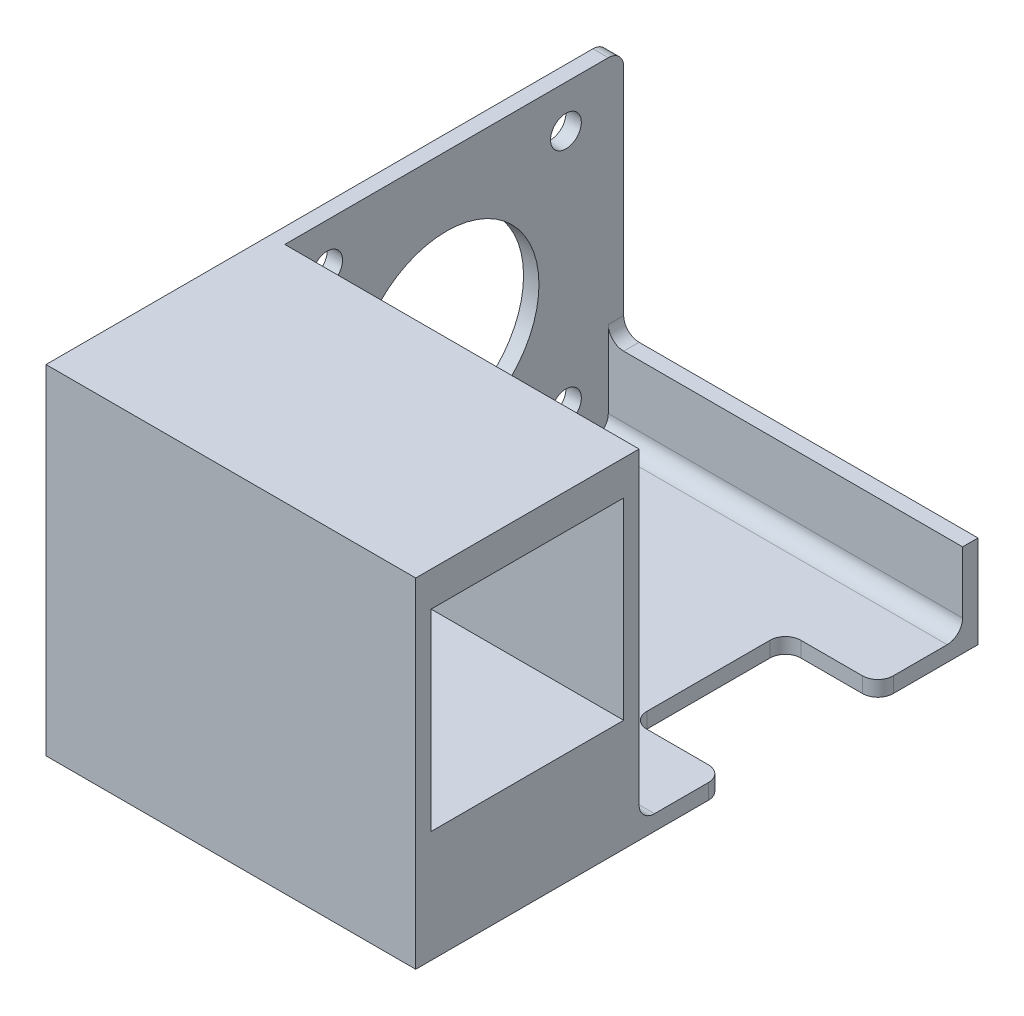
ISO-10303-21;
HEADER;
FILE_DESCRIPTION(('STEP AP214'),'2;1');
FILE_NAME('part.step','',(''),(''),'','','');
FILE_SCHEMA(('AUTOMOTIVE_DESIGN { 1 0 10303 214 1 1 1 1 }'));
ENDSEC;
DATA;
#1=APPLICATION_CONTEXT('core data for automotive mechanical design processes');
#2=APPLICATION_PROTOCOL_DEFINITION('international standard','automotive_design',2000,#1);
#3=PRODUCT_CONTEXT('',#1,'mechanical');
#4=PRODUCT('Part','Part','',(#3));
#5=PRODUCT_RELATED_PRODUCT_CATEGORY('part','',(#4));
#6=PRODUCT_DEFINITION_FORMATION('','',#4);
#7=PRODUCT_DEFINITION_CONTEXT('part definition',#1,'design');
#8=PRODUCT_DEFINITION('design','',#6,#7);
#9=PRODUCT_DEFINITION_SHAPE('','',#8);
#10=(LENGTH_UNIT() NAMED_UNIT(*) SI_UNIT(.MILLI.,.METRE.));
#11=(NAMED_UNIT(*) PLANE_ANGLE_UNIT() SI_UNIT($,.RADIAN.));
#12=(NAMED_UNIT(*) SI_UNIT($,.STERADIAN.) SOLID_ANGLE_UNIT());
#13=UNCERTAINTY_MEASURE_WITH_UNIT(LENGTH_MEASURE(1.E-05),#10,'distance_accuracy_value','');
#14=(GEOMETRIC_REPRESENTATION_CONTEXT(3) GLOBAL_UNCERTAINTY_ASSIGNED_CONTEXT((#13)) GLOBAL_UNIT_ASSIGNED_CONTEXT((#10,
#11,#12)) REPRESENTATION_CONTEXT('',''));
#15=CARTESIAN_POINT('',(0.,0.,0.));
#16=DIRECTION('',(0.,0.,1.));
#17=DIRECTION('',(1.,0.,0.));
#18=AXIS2_PLACEMENT_3D('',#15,#16,#17);
#19=CARTESIAN_POINT('',(24.,14.5,29.));
#20=DIRECTION('',(-1.,0.,0.));
#21=DIRECTION('',(0.,-1.,0.));
#22=AXIS2_PLACEMENT_3D('',#19,#20,#21);
#23=PLANE('',#22);
#24=DIRECTION('',(0.,0.,-1.));
#25=VECTOR('',#24,1.);
#26=CARTESIAN_POINT('',(24.,-23.,2.));
#27=LINE('',#26,#25);
#28=CARTESIAN_POINT('',(24.,-23.,29.));
#29=VERTEX_POINT('',#28);
#30=CARTESIAN_POINT('',(24.,-23.,-9.00000000000001));
#31=VERTEX_POINT('',#30);
#32=EDGE_CURVE('E326',#29,#31,#27,.T.);
#33=ORIENTED_EDGE('',*,*,#32,.T.);
#34=DIRECTION('',(0.,1.,0.));
#35=VECTOR('',#34,1.);
#36=CARTESIAN_POINT('',(24.,14.5,-9.00000000000001));
#37=LINE('',#36,#35);
#38=CARTESIAN_POINT('',(24.,-21.,-9.00000000000001));
#39=VERTEX_POINT('',#38);
#40=EDGE_CURVE('E409',#31,#39,#37,.T.);
#41=ORIENTED_EDGE('',*,*,#40,.T.);
#42=DIRECTION('',(0.,0.,-1.));
#43=VECTOR('',#42,1.);
#44=CARTESIAN_POINT('',(24.,-21.,2.));
#45=LINE('',#44,#43);
#46=CARTESIAN_POINT('',(24.,-21.,-2.));
#47=VERTEX_POINT('',#46);
#48=EDGE_CURVE('E321',#47,#39,#45,.T.);
#49=ORIENTED_EDGE('',*,*,#48,.F.);
#50=CARTESIAN_POINT('',(24.,-19.,-2.));
#51=DIRECTION('',(-1.,0.,0.));
#52=DIRECTION('',(0.,-1.,0.));
#53=AXIS2_PLACEMENT_3D('',#50,#51,#52);
#54=CIRCLE('',#53,2.);
#55=CARTESIAN_POINT('',(24.,-19.,0.));
#56=VERTEX_POINT('',#55);
#57=EDGE_CURVE('E365',#47,#56,#54,.T.);
#58=ORIENTED_EDGE('',*,*,#57,.T.);
#59=DIRECTION('',(0.,1.,0.));
#60=VECTOR('',#59,1.);
#61=CARTESIAN_POINT('',(24.,14.5,0.));
#62=LINE('',#61,#60);
#63=CARTESIAN_POINT('',(24.,21.,0.));
#64=VERTEX_POINT('',#63);
#65=EDGE_CURVE('E332',#56,#64,#62,.T.);
#66=ORIENTED_EDGE('',*,*,#65,.T.);
#67=DIRECTION('',(0.,0.,1.));
#68=VECTOR('',#67,1.);
#69=CARTESIAN_POINT('',(24.,21.,-44.));
#70=LINE('',#69,#68);
#71=CARTESIAN_POINT('',(24.,21.,29.));
#72=VERTEX_POINT('',#71);
#73=EDGE_CURVE('E238',#64,#72,#70,.T.);
#74=ORIENTED_EDGE('',*,*,#73,.T.);
#75=DIRECTION('',(0.,1.,0.));
#76=VECTOR('',#75,1.);
#77=CARTESIAN_POINT('',(24.,14.5,29.));
#78=LINE('',#77,#76);
#79=EDGE_CURVE('E337',#29,#72,#78,.T.);
#80=ORIENTED_EDGE('',*,*,#79,.F.);
#81=EDGE_LOOP('',(#33,#41,#49,#58,#66,#74,#80));
#82=FACE_BOUND('',#81,.T.);
#83=DIRECTION('',(0.,0.,-1.));
#84=VECTOR('',#83,1.);
#85=CARTESIAN_POINT('',(24.,-8.5,29.));
#86=LINE('',#85,#84);
#87=CARTESIAN_POINT('',(24.,-8.5,27.));
#88=VERTEX_POINT('',#87);
#89=CARTESIAN_POINT('',(24.,-8.5,2.));
#90=VERTEX_POINT('',#89);
#91=EDGE_CURVE('E228',#88,#90,#86,.T.);
#92=ORIENTED_EDGE('',*,*,#91,.F.);
#93=DIRECTION('',(0.,1.,0.));
#94=VECTOR('',#93,1.);
#95=CARTESIAN_POINT('',(24.,12.5,27.));
#96=LINE('',#95,#94);
#97=CARTESIAN_POINT('',(24.,16.5,27.));
#98=VERTEX_POINT('',#97);
#99=EDGE_CURVE('E328',#88,#98,#96,.T.);
#100=ORIENTED_EDGE('',*,*,#99,.T.);
#101=DIRECTION('',(0.,0.,-1.));
#102=VECTOR('',#101,1.);
#103=CARTESIAN_POINT('',(24.,16.5,29.));
#104=LINE('',#103,#102);
#105=CARTESIAN_POINT('',(24.,16.5,2.));
#106=VERTEX_POINT('',#105);
#107=EDGE_CURVE('E221',#98,#106,#104,.T.);
#108=ORIENTED_EDGE('',*,*,#107,.T.);
#109=DIRECTION('',(0.,-1.,0.));
#110=VECTOR('',#109,1.);
#111=CARTESIAN_POINT('',(24.,12.5,2.));
#112=LINE('',#111,#110);
#113=EDGE_CURVE('E330',#106,#90,#112,.T.);
#114=ORIENTED_EDGE('',*,*,#113,.T.);
#115=EDGE_LOOP('',(#92,#100,#108,#114));
#116=FACE_BOUND('',#115,.T.);
#117=ADVANCED_FACE('F32',(#82,#116),#23,.F.);
#118=CARTESIAN_POINT('',(-24.,-21.,2.));
#119=DIRECTION('',(0.,1.,0.));
#120=DIRECTION('',(-1.,0.,0.));
#121=AXIS2_PLACEMENT_3D('',#118,#119,#120);
#122=PLANE('',#121);
#123=DIRECTION('',(-1.,0.,0.));
#124=VECTOR('',#123,1.);
#125=CARTESIAN_POINT('',(12.,-21.,-31.));
#126=LINE('',#125,#124);
#127=CARTESIAN_POINT('',(22.,-21.,-31.));
#128=VERTEX_POINT('',#127);
#129=CARTESIAN_POINT('',(14.,-21.,-31.));
#130=VERTEX_POINT('',#129);
#131=EDGE_CURVE('E248',#128,#130,#126,.T.);
#132=ORIENTED_EDGE('',*,*,#131,.F.);
#133=CARTESIAN_POINT('',(22.,-21.,-33.));
#134=DIRECTION('',(0.,1.,0.));
#135=DIRECTION('',(-1.,0.,0.));
#136=AXIS2_PLACEMENT_3D('',#133,#134,#135);
#137=CIRCLE('',#136,2.);
#138=CARTESIAN_POINT('',(24.,-21.,-33.));
#139=VERTEX_POINT('',#138);
#140=EDGE_CURVE('E398',#128,#139,#137,.T.);
#141=ORIENTED_EDGE('',*,*,#140,.T.);
#142=CARTESIAN_POINT('',(24.,-21.,-40.));
#143=VERTEX_POINT('',#142);
#144=EDGE_CURVE('E320',#139,#143,#45,.T.);
#145=ORIENTED_EDGE('',*,*,#144,.T.);
#146=DIRECTION('',(-1.,0.,0.));
#147=VECTOR('',#146,1.);
#148=CARTESIAN_POINT('',(-24.,-21.,-40.));
#149=LINE('',#148,#147);
#150=CARTESIAN_POINT('',(-22.,-21.,-40.));
#151=VERTEX_POINT('',#150);
#152=EDGE_CURVE('E367',#143,#151,#149,.T.);
#153=ORIENTED_EDGE('',*,*,#152,.T.);
#154=DIRECTION('',(0.,0.,1.));
#155=VECTOR('',#154,1.);
#156=CARTESIAN_POINT('',(-22.,-21.,2.));
#157=LINE('',#156,#155);
#158=CARTESIAN_POINT('',(-22.,-21.,-2.));
#159=VERTEX_POINT('',#158);
#160=EDGE_CURVE('E307',#151,#159,#157,.T.);
#161=ORIENTED_EDGE('',*,*,#160,.T.);
#162=DIRECTION('',(1.,0.,0.));
#163=VECTOR('',#162,1.);
#164=CARTESIAN_POINT('',(24.,-21.,-2.));
#165=LINE('',#164,#163);
#166=EDGE_CURVE('E357',#159,#47,#165,.T.);
#167=ORIENTED_EDGE('',*,*,#166,.T.);
#168=ORIENTED_EDGE('',*,*,#48,.T.);
#169=CARTESIAN_POINT('',(22.,-21.,-9.00000000000001));
#170=DIRECTION('',(0.,1.,0.));
#171=DIRECTION('',(-1.,0.,0.));
#172=AXIS2_PLACEMENT_3D('',#169,#170,#171);
#173=CIRCLE('',#172,2.);
#174=CARTESIAN_POINT('',(22.,-21.,-11.));
#175=VERTEX_POINT('',#174);
#176=EDGE_CURVE('E396',#39,#175,#173,.T.);
#177=ORIENTED_EDGE('',*,*,#176,.T.);
#178=DIRECTION('',(1.,0.,0.));
#179=VECTOR('',#178,1.);
#180=CARTESIAN_POINT('',(12.,-21.,-11.));
#181=LINE('',#180,#179);
#182=CARTESIAN_POINT('',(14.,-21.,-11.));
#183=VERTEX_POINT('',#182);
#184=EDGE_CURVE('E253',#183,#175,#181,.T.);
#185=ORIENTED_EDGE('',*,*,#184,.F.);
#186=CARTESIAN_POINT('',(14.,-21.,-13.));
#187=DIRECTION('',(0.,1.,0.));
#188=DIRECTION('',(-1.,0.,0.));
#189=AXIS2_PLACEMENT_3D('',#186,#187,#188);
#190=CIRCLE('',#189,2.);
#191=CARTESIAN_POINT('',(12.,-21.,-13.));
#192=VERTEX_POINT('',#191);
#193=EDGE_CURVE('E40',#183,#192,#190,.F.);
#194=ORIENTED_EDGE('',*,*,#193,.T.);
#195=DIRECTION('',(0.,0.,1.));
#196=VECTOR('',#195,1.);
#197=CARTESIAN_POINT('',(12.,-21.,-31.));
#198=LINE('',#197,#196);
#199=CARTESIAN_POINT('',(12.,-21.,-29.));
#200=VERTEX_POINT('',#199);
#201=EDGE_CURVE('E261',#200,#192,#198,.T.);
#202=ORIENTED_EDGE('',*,*,#201,.F.);
#203=CARTESIAN_POINT('',(14.,-21.,-29.));
#204=DIRECTION('',(0.,1.,0.));
#205=DIRECTION('',(-1.,0.,0.));
#206=AXIS2_PLACEMENT_3D('',#203,#204,#205);
#207=CIRCLE('',#206,2.);
#208=EDGE_CURVE('E412',#200,#130,#207,.F.);
#209=ORIENTED_EDGE('',*,*,#208,.T.);
#210=EDGE_LOOP('',(#132,#141,#145,#153,#161,#167,#168,#177,#185,#194,#202,#209));
#211=FACE_BOUND('',#210,.T.);
#212=ADVANCED_FACE('F419',(#211),#122,.T.);
#213=CARTESIAN_POINT('',(0.,0.,0.));
#214=DIRECTION('',(0.,0.,-1.));
#215=DIRECTION('',(-1.,0.,0.));
#216=AXIS2_PLACEMENT_3D('',#213,#214,#215);
#217=PLANE('',#216);
#218=ORIENTED_EDGE('',*,*,#65,.F.);
#219=DIRECTION('',(1.,0.,0.));
#220=VECTOR('',#219,1.);
#221=CARTESIAN_POINT('',(-22.,-19.,0.));
#222=LINE('',#221,#220);
#223=CARTESIAN_POINT('',(-22.,-19.,0.));
#224=VERTEX_POINT('',#223);
#225=EDGE_CURVE('E360',#56,#224,#222,.F.);
#226=ORIENTED_EDGE('',*,*,#225,.T.);
#227=DIRECTION('',(0.,-1.,0.));
#228=VECTOR('',#227,1.);
#229=CARTESIAN_POINT('',(-22.,23.,0.));
#230=LINE('',#229,#228);
#231=CARTESIAN_POINT('',(-22.,21.,0.));
#232=VERTEX_POINT('',#231);
#233=EDGE_CURVE('E304',#232,#224,#230,.T.);
#234=ORIENTED_EDGE('',*,*,#233,.F.);
#235=DIRECTION('',(-1.,0.,0.));
#236=VECTOR('',#235,1.);
#237=CARTESIAN_POINT('',(0.,21.,0.));
#238=LINE('',#237,#236);
#239=EDGE_CURVE('E241',#64,#232,#238,.T.);
#240=ORIENTED_EDGE('',*,*,#239,.F.);
#241=EDGE_LOOP('',(#218,#226,#234,#240));
#242=FACE_BOUND('',#241,.T.);
#243=ADVANCED_FACE('F447',(#242),#217,.T.);
#244=CARTESIAN_POINT('',(-24.,14.5,29.));
#245=DIRECTION('',(1.,0.,0.));
#246=DIRECTION('',(0.,1.,0.));
#247=AXIS2_PLACEMENT_3D('',#244,#245,#246);
#248=PLANE('',#247);
#249=DIRECTION('',(0.,0.,-1.));
#250=VECTOR('',#249,1.);
#251=CARTESIAN_POINT('',(-24.,-8.5,29.));
#252=LINE('',#251,#250);
#253=CARTESIAN_POINT('',(-24.,-8.50000000000001,27.));
#254=VERTEX_POINT('',#253);
#255=CARTESIAN_POINT('',(-24.,-8.50000000000001,2.));
#256=VERTEX_POINT('',#255);
#257=EDGE_CURVE('E839',#254,#256,#252,.T.);
#258=ORIENTED_EDGE('',*,*,#257,.T.);
#259=DIRECTION('',(0.,-1.,0.));
#260=VECTOR('',#259,1.);
#261=CARTESIAN_POINT('',(-24.,12.5,2.));
#262=LINE('',#261,#260);
#263=CARTESIAN_POINT('',(-24.,16.5,2.));
#264=VERTEX_POINT('',#263);
#265=EDGE_CURVE('E211',#264,#256,#262,.T.);
#266=ORIENTED_EDGE('',*,*,#265,.F.);
#267=DIRECTION('',(0.,0.,-1.));
#268=VECTOR('',#267,1.);
#269=CARTESIAN_POINT('',(-24.,16.5,2.));
#270=LINE('',#269,#268);
#271=CARTESIAN_POINT('',(-24.,16.5,27.));
#272=VERTEX_POINT('',#271);
#273=EDGE_CURVE('E219',#272,#264,#270,.T.);
#274=ORIENTED_EDGE('',*,*,#273,.F.);
#275=DIRECTION('',(0.,1.,0.));
#276=VECTOR('',#275,1.);
#277=CARTESIAN_POINT('',(-24.,12.5,27.));
#278=LINE('',#277,#276);
#279=EDGE_CURVE('E201',#254,#272,#278,.T.);
#280=ORIENTED_EDGE('',*,*,#279,.F.);
#281=EDGE_LOOP('',(#258,#266,#274,#280));
#282=FACE_BOUND('',#281,.T.);
#283=DIRECTION('',(0.,0.,1.));
#284=VECTOR('',#283,1.);
#285=CARTESIAN_POINT('',(-24.,21.,-44.));
#286=LINE('',#285,#284);
#287=CARTESIAN_POINT('',(-24.,21.,-42.));
#288=VERTEX_POINT('',#287);
#289=CARTESIAN_POINT('',(-24.,21.,29.));
#290=VERTEX_POINT('',#289);
#291=EDGE_CURVE('E237',#288,#290,#286,.T.);
#292=ORIENTED_EDGE('',*,*,#291,.F.);
#293=CARTESIAN_POINT('',(-24.,19.,-42.));
#294=DIRECTION('',(1.,0.,0.));
#295=DIRECTION('',(0.,1.,0.));
#296=AXIS2_PLACEMENT_3D('',#293,#294,#295);
#297=CIRCLE('',#296,2.);
#298=CARTESIAN_POINT('',(-24.,19.,-44.));
#299=VERTEX_POINT('',#298);
#300=EDGE_CURVE('E384',#288,#299,#297,.F.);
#301=ORIENTED_EDGE('',*,*,#300,.T.);
#302=DIRECTION('',(0.,1.,0.));
#303=VECTOR('',#302,1.);
#304=CARTESIAN_POINT('',(-24.,-23.,-44.));
#305=LINE('',#304,#303);
#306=CARTESIAN_POINT('',(-24.,-23.,-44.));
#307=VERTEX_POINT('',#306);
#308=EDGE_CURVE('E311',#307,#299,#305,.T.);
#309=ORIENTED_EDGE('',*,*,#308,.F.);
#310=DIRECTION('',(0.,0.,-1.));
#311=VECTOR('',#310,1.);
#312=CARTESIAN_POINT('',(-24.,-23.,2.));
#313=LINE('',#312,#311);
#314=CARTESIAN_POINT('',(-24.,-23.,29.));
#315=VERTEX_POINT('',#314);
#316=EDGE_CURVE('E212',#315,#307,#313,.T.);
#317=ORIENTED_EDGE('',*,*,#316,.F.);
#318=DIRECTION('',(0.,-1.,0.));
#319=VECTOR('',#318,1.);
#320=CARTESIAN_POINT('',(-24.,14.5,29.));
#321=LINE('',#320,#319);
#322=EDGE_CURVE('E335',#290,#315,#321,.T.);
#323=ORIENTED_EDGE('',*,*,#322,.F.);
#324=EDGE_LOOP('',(#292,#301,#309,#317,#323));
#325=FACE_BOUND('',#324,.T.);
#326=CARTESIAN_POINT('',(-24.,15.5,-5.50000000000001));
#327=DIRECTION('',(-1.,0.,0.));
#328=DIRECTION('',(0.,-1.,0.));
#329=AXIS2_PLACEMENT_3D('',#326,#327,#328);
#330=CIRCLE('',#329,2.);
#331=CARTESIAN_POINT('',(-24.,13.5,-5.50000000000001));
#332=VERTEX_POINT('',#331);
#333=EDGE_CURVE('E269',#332,#332,#330,.T.);
#334=ORIENTED_EDGE('',*,*,#333,.F.);
#335=EDGE_LOOP('',(#334));
#336=FACE_BOUND('',#335,.T.);
#337=CARTESIAN_POINT('',(-24.,-15.5,-5.50000000000001));
#338=DIRECTION('',(-1.,0.,0.));
#339=DIRECTION('',(0.,-1.,0.));
#340=AXIS2_PLACEMENT_3D('',#337,#338,#339);
#341=CIRCLE('',#340,2.);
#342=CARTESIAN_POINT('',(-24.,-17.5,-5.50000000000001));
#343=VERTEX_POINT('',#342);
#344=EDGE_CURVE('E275',#343,#343,#341,.T.);
#345=ORIENTED_EDGE('',*,*,#344,.F.);
#346=EDGE_LOOP('',(#345));
#347=FACE_BOUND('',#346,.T.);
#348=CARTESIAN_POINT('',(-24.,-15.5,-36.5));
#349=DIRECTION('',(-1.,0.,0.));
#350=DIRECTION('',(0.,-1.,0.));
#351=AXIS2_PLACEMENT_3D('',#348,#349,#350);
#352=CIRCLE('',#351,2.);
#353=CARTESIAN_POINT('',(-24.,-17.5,-36.5));
#354=VERTEX_POINT('',#353);
#355=EDGE_CURVE('E281',#354,#354,#352,.T.);
#356=ORIENTED_EDGE('',*,*,#355,.F.);
#357=EDGE_LOOP('',(#356));
#358=FACE_BOUND('',#357,.T.);
#359=CARTESIAN_POINT('',(-24.,0.,-21.));
#360=DIRECTION('',(-1.,0.,0.));
#361=DIRECTION('',(0.,-1.,0.));
#362=AXIS2_PLACEMENT_3D('',#359,#360,#361);
#363=CIRCLE('',#362,12.);
#364=CARTESIAN_POINT('',(-24.,-12.,-21.));
#365=VERTEX_POINT('',#364);
#366=EDGE_CURVE('E258',#365,#365,#363,.T.);
#367=ORIENTED_EDGE('',*,*,#366,.F.);
#368=EDGE_LOOP('',(#367));
#369=FACE_BOUND('',#368,.T.);
#370=CARTESIAN_POINT('',(-24.,15.5,-36.5));
#371=DIRECTION('',(-1.,0.,0.));
#372=DIRECTION('',(0.,-1.,0.));
#373=AXIS2_PLACEMENT_3D('',#370,#371,#372);
#374=CIRCLE('',#373,2.);
#375=CARTESIAN_POINT('',(-24.,13.5,-36.5));
#376=VERTEX_POINT('',#375);
#377=EDGE_CURVE('E268',#376,#376,#374,.T.);
#378=ORIENTED_EDGE('',*,*,#377,.F.);
#379=EDGE_LOOP('',(#378));
#380=FACE_BOUND('',#379,.T.);
#381=ADVANCED_FACE('F224',(#282,#325,#336,#347,#358,#369,#380),#248,.F.);
#382=ORIENTED_EDGE('',*,*,#144,.F.);
#383=DIRECTION('',(0.,1.,0.));
#384=VECTOR('',#383,1.);
#385=CARTESIAN_POINT('',(24.,14.5,-33.));
#386=LINE('',#385,#384);
#387=CARTESIAN_POINT('',(24.,-23.,-33.));
#388=VERTEX_POINT('',#387);
#389=EDGE_CURVE('E400',#139,#388,#386,.F.);
#390=ORIENTED_EDGE('',*,*,#389,.T.);
#391=CARTESIAN_POINT('',(24.,-23.,-44.));
#392=VERTEX_POINT('',#391);
#393=EDGE_CURVE('E324',#388,#392,#27,.T.);
#394=ORIENTED_EDGE('',*,*,#393,.T.);
#395=DIRECTION('',(0.,-1.,0.));
#396=VECTOR('',#395,1.);
#397=CARTESIAN_POINT('',(24.,-23.,-44.));
#398=LINE('',#397,#396);
#399=CARTESIAN_POINT('',(24.,-11.,-44.));
#400=VERTEX_POINT('',#399);
#401=EDGE_CURVE('E314',#400,#392,#398,.T.);
#402=ORIENTED_EDGE('',*,*,#401,.F.);
#403=DIRECTION('',(0.,0.,-1.));
#404=VECTOR('',#403,1.);
#405=CARTESIAN_POINT('',(24.,-11.,-42.));
#406=LINE('',#405,#404);
#407=CARTESIAN_POINT('',(24.,-11.,-42.));
#408=VERTEX_POINT('',#407);
#409=EDGE_CURVE('E300',#408,#400,#406,.T.);
#410=ORIENTED_EDGE('',*,*,#409,.F.);
#411=DIRECTION('',(0.,-1.,0.));
#412=VECTOR('',#411,1.);
#413=CARTESIAN_POINT('',(24.,-23.,-42.));
#414=LINE('',#413,#412);
#415=CARTESIAN_POINT('',(24.,-19.,-42.));
#416=VERTEX_POINT('',#415);
#417=EDGE_CURVE('E297',#408,#416,#414,.T.);
#418=ORIENTED_EDGE('',*,*,#417,.T.);
#419=CARTESIAN_POINT('',(24.,-19.,-40.));
#420=DIRECTION('',(-1.,0.,0.));
#421=DIRECTION('',(0.,-1.,0.));
#422=AXIS2_PLACEMENT_3D('',#419,#420,#421);
#423=CIRCLE('',#422,2.);
#424=EDGE_CURVE('E374',#416,#143,#423,.T.);
#425=ORIENTED_EDGE('',*,*,#424,.T.);
#426=EDGE_LOOP('',(#382,#390,#394,#402,#410,#418,#425));
#427=FACE_BOUND('',#426,.T.);
#428=ADVANCED_FACE('F471',(#427),#23,.F.);
#429=CARTESIAN_POINT('',(0.,0.,29.));
#430=DIRECTION('',(0.,0.,-1.));
#431=DIRECTION('',(-1.,0.,0.));
#432=AXIS2_PLACEMENT_3D('',#429,#430,#431);
#433=PLANE('',#432);
#434=ORIENTED_EDGE('',*,*,#322,.T.);
#435=DIRECTION('',(1.,0.,0.));
#436=VECTOR('',#435,1.);
#437=CARTESIAN_POINT('',(24.,-23.,29.));
#438=LINE('',#437,#436);
#439=EDGE_CURVE('E245',#315,#29,#438,.T.);
#440=ORIENTED_EDGE('',*,*,#439,.T.);
#441=ORIENTED_EDGE('',*,*,#79,.T.);
#442=DIRECTION('',(1.,0.,0.));
#443=VECTOR('',#442,1.);
#444=CARTESIAN_POINT('',(-24.,21.,29.));
#445=LINE('',#444,#443);
#446=EDGE_CURVE('E234',#290,#72,#445,.T.);
#447=ORIENTED_EDGE('',*,*,#446,.F.);
#448=EDGE_LOOP('',(#434,#440,#441,#447));
#449=FACE_BOUND('',#448,.T.);
#450=ADVANCED_FACE('F456',(#449),#433,.F.);
#451=CARTESIAN_POINT('',(24.,12.5,27.));
#452=DIRECTION('',(0.,0.,1.));
#453=DIRECTION('',(0.,-1.,0.));
#454=AXIS2_PLACEMENT_3D('',#451,#452,#453);
#455=PLANE('',#454);
#456=ORIENTED_EDGE('',*,*,#99,.F.);
#457=DIRECTION('',(-1.,0.,0.));
#458=VECTOR('',#457,1.);
#459=CARTESIAN_POINT('',(24.,-8.5,27.));
#460=LINE('',#459,#458);
#461=EDGE_CURVE('E206',#88,#254,#460,.T.);
#462=ORIENTED_EDGE('',*,*,#461,.T.);
#463=ORIENTED_EDGE('',*,*,#279,.T.);
#464=DIRECTION('',(-1.,0.,0.));
#465=VECTOR('',#464,1.);
#466=CARTESIAN_POINT('',(49.,16.5,27.));
#467=LINE('',#466,#465);
#468=EDGE_CURVE('E204',#98,#272,#467,.T.);
#469=ORIENTED_EDGE('',*,*,#468,.F.);
#470=EDGE_LOOP('',(#456,#462,#463,#469));
#471=FACE_BOUND('',#470,.T.);
#472=ADVANCED_FACE('F203',(#471),#455,.F.);
#473=CARTESIAN_POINT('',(24.,12.5,2.));
#474=DIRECTION('',(0.,0.,-1.));
#475=DIRECTION('',(0.,1.,0.));
#476=AXIS2_PLACEMENT_3D('',#473,#474,#475);
#477=PLANE('',#476);
#478=ORIENTED_EDGE('',*,*,#265,.T.);
#479=DIRECTION('',(1.,0.,0.));
#480=VECTOR('',#479,1.);
#481=CARTESIAN_POINT('',(24.,-8.5,2.));
#482=LINE('',#481,#480);
#483=EDGE_CURVE('E355',#256,#90,#482,.T.);
#484=ORIENTED_EDGE('',*,*,#483,.T.);
#485=ORIENTED_EDGE('',*,*,#113,.F.);
#486=DIRECTION('',(-1.,0.,0.));
#487=VECTOR('',#486,1.);
#488=CARTESIAN_POINT('',(49.,16.5,2.));
#489=LINE('',#488,#487);
#490=EDGE_CURVE('E222',#106,#264,#489,.T.);
#491=ORIENTED_EDGE('',*,*,#490,.T.);
#492=EDGE_LOOP('',(#478,#484,#485,#491));
#493=FACE_BOUND('',#492,.T.);
#494=ADVANCED_FACE('F583',(#493),#477,.F.);
#495=CARTESIAN_POINT('',(-24.,-23.,2.));
#496=DIRECTION('',(0.,-1.,0.));
#497=DIRECTION('',(1.,0.,0.));
#498=AXIS2_PLACEMENT_3D('',#495,#496,#497);
#499=PLANE('',#498);
#500=ORIENTED_EDGE('',*,*,#393,.F.);
#501=CARTESIAN_POINT('',(22.,-23.,-33.));
#502=DIRECTION('',(0.,-1.,0.));
#503=DIRECTION('',(1.,0.,0.));
#504=AXIS2_PLACEMENT_3D('',#501,#502,#503);
#505=CIRCLE('',#504,2.);
#506=CARTESIAN_POINT('',(22.,-23.,-31.));
#507=VERTEX_POINT('',#506);
#508=EDGE_CURVE('E403',#388,#507,#505,.T.);
#509=ORIENTED_EDGE('',*,*,#508,.T.);
#510=DIRECTION('',(-1.,0.,0.));
#511=VECTOR('',#510,1.);
#512=CARTESIAN_POINT('',(12.,-23.,-31.));
#513=LINE('',#512,#511);
#514=CARTESIAN_POINT('',(14.,-23.,-31.));
#515=VERTEX_POINT('',#514);
#516=EDGE_CURVE('E249',#507,#515,#513,.T.);
#517=ORIENTED_EDGE('',*,*,#516,.T.);
#518=CARTESIAN_POINT('',(14.,-23.,-29.));
#519=DIRECTION('',(0.,-1.,0.));
#520=DIRECTION('',(1.,0.,0.));
#521=AXIS2_PLACEMENT_3D('',#518,#519,#520);
#522=CIRCLE('',#521,2.);
#523=CARTESIAN_POINT('',(12.,-23.,-29.));
#524=VERTEX_POINT('',#523);
#525=EDGE_CURVE('E414',#515,#524,#522,.F.);
#526=ORIENTED_EDGE('',*,*,#525,.T.);
#527=DIRECTION('',(0.,0.,1.));
#528=VECTOR('',#527,1.);
#529=CARTESIAN_POINT('',(12.,-23.,-31.));
#530=LINE('',#529,#528);
#531=CARTESIAN_POINT('',(12.,-23.,-13.));
#532=VERTEX_POINT('',#531);
#533=EDGE_CURVE('E252',#524,#532,#530,.T.);
#534=ORIENTED_EDGE('',*,*,#533,.T.);
#535=CARTESIAN_POINT('',(14.,-23.,-13.));
#536=DIRECTION('',(0.,-1.,0.));
#537=DIRECTION('',(1.,0.,0.));
#538=AXIS2_PLACEMENT_3D('',#535,#536,#537);
#539=CIRCLE('',#538,2.);
#540=CARTESIAN_POINT('',(14.,-23.,-11.));
#541=VERTEX_POINT('',#540);
#542=EDGE_CURVE('E11',#532,#541,#539,.F.);
#543=ORIENTED_EDGE('',*,*,#542,.T.);
#544=DIRECTION('',(1.,0.,0.));
#545=VECTOR('',#544,1.);
#546=CARTESIAN_POINT('',(12.,-23.,-11.));
#547=LINE('',#546,#545);
#548=CARTESIAN_POINT('',(22.,-23.,-11.));
#549=VERTEX_POINT('',#548);
#550=EDGE_CURVE('E256',#541,#549,#547,.T.);
#551=ORIENTED_EDGE('',*,*,#550,.T.);
#552=CARTESIAN_POINT('',(22.,-23.,-9.00000000000001));
#553=DIRECTION('',(0.,-1.,0.));
#554=DIRECTION('',(1.,0.,0.));
#555=AXIS2_PLACEMENT_3D('',#552,#553,#554);
#556=CIRCLE('',#555,2.);
#557=EDGE_CURVE('E47',#549,#31,#556,.T.);
#558=ORIENTED_EDGE('',*,*,#557,.T.);
#559=ORIENTED_EDGE('',*,*,#32,.F.);
#560=ORIENTED_EDGE('',*,*,#439,.F.);
#561=ORIENTED_EDGE('',*,*,#316,.T.);
#562=DIRECTION('',(-1.,0.,0.));
#563=VECTOR('',#562,1.);
#564=CARTESIAN_POINT('',(-24.,-23.,-44.));
#565=LINE('',#564,#563);
#566=EDGE_CURVE('E317',#392,#307,#565,.T.);
#567=ORIENTED_EDGE('',*,*,#566,.F.);
#568=EDGE_LOOP('',(#500,#509,#517,#526,#534,#543,#551,#558,#559,#560,#561,#567));
#569=FACE_BOUND('',#568,.T.);
#570=ADVANCED_FACE('F430',(#569),#499,.T.);
#571=CARTESIAN_POINT('',(0.,0.,-44.));
#572=DIRECTION('',(0.,0.,-1.));
#573=DIRECTION('',(-1.,0.,0.));
#574=AXIS2_PLACEMENT_3D('',#571,#572,#573);
#575=PLANE('',#574);
#576=ORIENTED_EDGE('',*,*,#308,.T.);
#577=DIRECTION('',(1.,0.,0.));
#578=VECTOR('',#577,1.);
#579=CARTESIAN_POINT('',(-22.,19.,-44.));
#580=LINE('',#579,#578);
#581=CARTESIAN_POINT('',(-22.,19.,-44.));
#582=VERTEX_POINT('',#581);
#583=EDGE_CURVE('E377',#299,#582,#580,.T.);
#584=ORIENTED_EDGE('',*,*,#583,.T.);
#585=DIRECTION('',(0.,-1.,0.));
#586=VECTOR('',#585,1.);
#587=CARTESIAN_POINT('',(-22.,23.,-44.));
#588=LINE('',#587,#586);
#589=CARTESIAN_POINT('',(-22.,-9.,-44.));
#590=VERTEX_POINT('',#589);
#591=EDGE_CURVE('E305',#582,#590,#588,.T.);
#592=ORIENTED_EDGE('',*,*,#591,.T.);
#593=CARTESIAN_POINT('',(-20.,-9.,-44.));
#594=DIRECTION('',(0.,0.,-1.));
#595=DIRECTION('',(-1.,0.,0.));
#596=AXIS2_PLACEMENT_3D('',#593,#594,#595);
#597=CIRCLE('',#596,2.);
#598=CARTESIAN_POINT('',(-20.,-11.,-44.));
#599=VERTEX_POINT('',#598);
#600=EDGE_CURVE('E348',#590,#599,#597,.F.);
#601=ORIENTED_EDGE('',*,*,#600,.T.);
#602=DIRECTION('',(1.,0.,0.));
#603=VECTOR('',#602,1.);
#604=CARTESIAN_POINT('',(-24.,-11.,-44.));
#605=LINE('',#604,#603);
#606=EDGE_CURVE('E292',#599,#400,#605,.T.);
#607=ORIENTED_EDGE('',*,*,#606,.T.);
#608=ORIENTED_EDGE('',*,*,#401,.T.);
#609=ORIENTED_EDGE('',*,*,#566,.T.);
#610=EDGE_LOOP('',(#576,#584,#592,#601,#607,#608,#609));
#611=FACE_BOUND('',#610,.T.);
#612=ADVANCED_FACE('F464',(#611),#575,.T.);
#613=CARTESIAN_POINT('',(-22.,23.,-44.));
#614=DIRECTION('',(-1.,0.,0.));
#615=DIRECTION('',(0.,-1.,0.));
#616=AXIS2_PLACEMENT_3D('',#613,#614,#615);
#617=PLANE('',#616);
#618=CARTESIAN_POINT('',(-22.,15.5,-5.50000000000001));
#619=DIRECTION('',(-1.,0.,0.));
#620=DIRECTION('',(0.,-1.,0.));
#621=AXIS2_PLACEMENT_3D('',#618,#619,#620);
#622=CIRCLE('',#621,2.);
#623=CARTESIAN_POINT('',(-22.,13.5,-5.50000000000001));
#624=VERTEX_POINT('',#623);
#625=EDGE_CURVE('E265',#624,#624,#622,.T.);
#626=ORIENTED_EDGE('',*,*,#625,.T.);
#627=EDGE_LOOP('',(#626));
#628=FACE_BOUND('',#627,.T.);
#629=CARTESIAN_POINT('',(-22.,-15.5,-5.50000000000001));
#630=DIRECTION('',(-1.,0.,0.));
#631=DIRECTION('',(0.,-1.,0.));
#632=AXIS2_PLACEMENT_3D('',#629,#630,#631);
#633=CIRCLE('',#632,2.);
#634=CARTESIAN_POINT('',(-22.,-17.5,-5.50000000000001));
#635=VERTEX_POINT('',#634);
#636=EDGE_CURVE('E272',#635,#635,#633,.T.);
#637=ORIENTED_EDGE('',*,*,#636,.T.);
#638=EDGE_LOOP('',(#637));
#639=FACE_BOUND('',#638,.T.);
#640=CARTESIAN_POINT('',(-22.,-15.5,-36.5));
#641=DIRECTION('',(-1.,0.,0.));
#642=DIRECTION('',(0.,-1.,0.));
#643=AXIS2_PLACEMENT_3D('',#640,#641,#642);
#644=CIRCLE('',#643,2.);
#645=CARTESIAN_POINT('',(-22.,-17.5,-36.5));
#646=VERTEX_POINT('',#645);
#647=EDGE_CURVE('E278',#646,#646,#644,.T.);
#648=ORIENTED_EDGE('',*,*,#647,.T.);
#649=EDGE_LOOP('',(#648));
#650=FACE_BOUND('',#649,.T.);
#651=CARTESIAN_POINT('',(-22.,0.,-21.));
#652=DIRECTION('',(-1.,0.,0.));
#653=DIRECTION('',(0.,-1.,0.));
#654=AXIS2_PLACEMENT_3D('',#651,#652,#653);
#655=CIRCLE('',#654,12.);
#656=CARTESIAN_POINT('',(-22.,-12.,-21.));
#657=VERTEX_POINT('',#656);
#658=EDGE_CURVE('E284',#657,#657,#655,.T.);
#659=ORIENTED_EDGE('',*,*,#658,.T.);
#660=EDGE_LOOP('',(#659));
#661=FACE_BOUND('',#660,.T.);
#662=CARTESIAN_POINT('',(-22.,15.5,-36.5));
#663=DIRECTION('',(-1.,0.,0.));
#664=DIRECTION('',(0.,-1.,0.));
#665=AXIS2_PLACEMENT_3D('',#662,#663,#664);
#666=CIRCLE('',#665,2.);
#667=CARTESIAN_POINT('',(-22.,13.5,-36.5));
#668=VERTEX_POINT('',#667);
#669=EDGE_CURVE('E289',#668,#668,#666,.T.);
#670=ORIENTED_EDGE('',*,*,#669,.T.);
#671=EDGE_LOOP('',(#670));
#672=FACE_BOUND('',#671,.T.);
#673=ORIENTED_EDGE('',*,*,#591,.F.);
#674=CARTESIAN_POINT('',(-22.,19.,-42.));
#675=DIRECTION('',(-1.,0.,0.));
#676=DIRECTION('',(0.,-1.,0.));
#677=AXIS2_PLACEMENT_3D('',#674,#675,#676);
#678=CIRCLE('',#677,2.);
#679=CARTESIAN_POINT('',(-22.,21.,-42.));
#680=VERTEX_POINT('',#679);
#681=EDGE_CURVE('E380',#582,#680,#678,.F.);
#682=ORIENTED_EDGE('',*,*,#681,.T.);
#683=DIRECTION('',(0.,0.,1.));
#684=VECTOR('',#683,1.);
#685=CARTESIAN_POINT('',(-22.,21.,-44.));
#686=LINE('',#685,#684);
#687=EDGE_CURVE('E353',#680,#232,#686,.T.);
#688=ORIENTED_EDGE('',*,*,#687,.T.);
#689=ORIENTED_EDGE('',*,*,#233,.T.);
#690=CARTESIAN_POINT('',(-22.,-19.,-2.));
#691=DIRECTION('',(-1.,0.,0.));
#692=DIRECTION('',(0.,-1.,0.));
#693=AXIS2_PLACEMENT_3D('',#690,#691,#692);
#694=CIRCLE('',#693,2.);
#695=EDGE_CURVE('E362',#224,#159,#694,.F.);
#696=ORIENTED_EDGE('',*,*,#695,.T.);
#697=ORIENTED_EDGE('',*,*,#160,.F.);
#698=CARTESIAN_POINT('',(-22.,-19.,-40.));
#699=DIRECTION('',(-1.,0.,0.));
#700=DIRECTION('',(0.,-1.,0.));
#701=AXIS2_PLACEMENT_3D('',#698,#699,#700);
#702=CIRCLE('',#701,2.);
#703=CARTESIAN_POINT('',(-22.,-19.,-42.));
#704=VERTEX_POINT('',#703);
#705=EDGE_CURVE('E370',#151,#704,#702,.F.);
#706=ORIENTED_EDGE('',*,*,#705,.T.);
#707=DIRECTION('',(0.,-1.,0.));
#708=VECTOR('',#707,1.);
#709=CARTESIAN_POINT('',(-22.,23.,-42.));
#710=LINE('',#709,#708);
#711=CARTESIAN_POINT('',(-22.,-9.,-42.));
#712=VERTEX_POINT('',#711);
#713=EDGE_CURVE('E339',#712,#704,#710,.T.);
#714=ORIENTED_EDGE('',*,*,#713,.F.);
#715=DIRECTION('',(0.,0.,-1.));
#716=VECTOR('',#715,1.);
#717=CARTESIAN_POINT('',(-22.,-9.,-44.));
#718=LINE('',#717,#716);
#719=EDGE_CURVE('E343',#712,#590,#718,.T.);
#720=ORIENTED_EDGE('',*,*,#719,.T.);
#721=EDGE_LOOP('',(#673,#682,#688,#689,#696,#697,#706,#714,#720));
#722=FACE_BOUND('',#721,.T.);
#723=ADVANCED_FACE('F486',(#628,#639,#650,#661,#672,#722),#617,.F.);
#724=CARTESIAN_POINT('',(-24.,-11.,-42.));
#725=DIRECTION('',(0.,1.,0.));
#726=DIRECTION('',(-1.,0.,0.));
#727=AXIS2_PLACEMENT_3D('',#724,#725,#726);
#728=PLANE('',#727);
#729=ORIENTED_EDGE('',*,*,#606,.F.);
#730=DIRECTION('',(0.,0.,-1.));
#731=VECTOR('',#730,1.);
#732=CARTESIAN_POINT('',(-20.,-11.,-42.));
#733=LINE('',#732,#731);
#734=CARTESIAN_POINT('',(-20.,-11.,-42.));
#735=VERTEX_POINT('',#734);
#736=EDGE_CURVE('E346',#599,#735,#733,.F.);
#737=ORIENTED_EDGE('',*,*,#736,.T.);
#738=DIRECTION('',(1.,0.,0.));
#739=VECTOR('',#738,1.);
#740=CARTESIAN_POINT('',(-24.,-11.,-42.));
#741=LINE('',#740,#739);
#742=EDGE_CURVE('E295',#735,#408,#741,.T.);
#743=ORIENTED_EDGE('',*,*,#742,.T.);
#744=ORIENTED_EDGE('',*,*,#409,.T.);
#745=EDGE_LOOP('',(#729,#737,#743,#744));
#746=FACE_BOUND('',#745,.T.);
#747=ADVANCED_FACE('F474',(#746),#728,.T.);
#748=CARTESIAN_POINT('',(0.,0.,-42.));
#749=DIRECTION('',(0.,0.,-1.));
#750=DIRECTION('',(-1.,0.,0.));
#751=AXIS2_PLACEMENT_3D('',#748,#749,#750);
#752=PLANE('',#751);
#753=ORIENTED_EDGE('',*,*,#713,.T.);
#754=DIRECTION('',(-1.,0.,0.));
#755=VECTOR('',#754,1.);
#756=CARTESIAN_POINT('',(0.,-19.,-42.));
#757=LINE('',#756,#755);
#758=EDGE_CURVE('E372',#704,#416,#757,.F.);
#759=ORIENTED_EDGE('',*,*,#758,.T.);
#760=ORIENTED_EDGE('',*,*,#417,.F.);
#761=ORIENTED_EDGE('',*,*,#742,.F.);
#762=CARTESIAN_POINT('',(-20.,-9.,-42.));
#763=DIRECTION('',(0.,0.,-1.));
#764=DIRECTION('',(-1.,0.,0.));
#765=AXIS2_PLACEMENT_3D('',#762,#763,#764);
#766=CIRCLE('',#765,2.);
#767=EDGE_CURVE('E350',#735,#712,#766,.T.);
#768=ORIENTED_EDGE('',*,*,#767,.T.);
#769=EDGE_LOOP('',(#753,#759,#760,#761,#768));
#770=FACE_BOUND('',#769,.T.);
#771=ADVANCED_FACE('F479',(#770),#752,.F.);
#772=CARTESIAN_POINT('',(-22.,15.5,-36.5));
#773=DIRECTION('',(-1.,0.,0.));
#774=DIRECTION('',(0.,-1.,0.));
#775=AXIS2_PLACEMENT_3D('',#772,#773,#774);
#776=CYLINDRICAL_SURFACE('',#775,2.);
#777=ORIENTED_EDGE('',*,*,#669,.F.);
#778=EDGE_LOOP('',(#777));
#779=FACE_BOUND('',#778,.T.);
#780=ORIENTED_EDGE('',*,*,#377,.T.);
#781=EDGE_LOOP('',(#780));
#782=FACE_BOUND('',#781,.T.);
#783=ADVANCED_FACE('F681',(#779,#782),#776,.F.);
#784=CARTESIAN_POINT('',(-22.,0.,-21.));
#785=DIRECTION('',(-1.,0.,0.));
#786=DIRECTION('',(0.,-1.,0.));
#787=AXIS2_PLACEMENT_3D('',#784,#785,#786);
#788=CYLINDRICAL_SURFACE('',#787,12.);
#789=ORIENTED_EDGE('',*,*,#658,.F.);
#790=EDGE_LOOP('',(#789));
#791=FACE_BOUND('',#790,.T.);
#792=ORIENTED_EDGE('',*,*,#366,.T.);
#793=EDGE_LOOP('',(#792));
#794=FACE_BOUND('',#793,.T.);
#795=ADVANCED_FACE('F695',(#791,#794),#788,.F.);
#796=CARTESIAN_POINT('',(-22.,-15.5,-36.5));
#797=DIRECTION('',(-1.,0.,0.));
#798=DIRECTION('',(0.,-1.,0.));
#799=AXIS2_PLACEMENT_3D('',#796,#797,#798);
#800=CYLINDRICAL_SURFACE('',#799,2.);
#801=ORIENTED_EDGE('',*,*,#647,.F.);
#802=EDGE_LOOP('',(#801));
#803=FACE_BOUND('',#802,.T.);
#804=ORIENTED_EDGE('',*,*,#355,.T.);
#805=EDGE_LOOP('',(#804));
#806=FACE_BOUND('',#805,.T.);
#807=ADVANCED_FACE('F702',(#803,#806),#800,.F.);
#808=CARTESIAN_POINT('',(-22.,-15.5,-5.50000000000001));
#809=DIRECTION('',(-1.,0.,0.));
#810=DIRECTION('',(0.,-1.,0.));
#811=AXIS2_PLACEMENT_3D('',#808,#809,#810);
#812=CYLINDRICAL_SURFACE('',#811,2.);
#813=ORIENTED_EDGE('',*,*,#636,.F.);
#814=EDGE_LOOP('',(#813));
#815=FACE_BOUND('',#814,.T.);
#816=ORIENTED_EDGE('',*,*,#344,.T.);
#817=EDGE_LOOP('',(#816));
#818=FACE_BOUND('',#817,.T.);
#819=ADVANCED_FACE('F710',(#815,#818),#812,.F.);
#820=CARTESIAN_POINT('',(-22.,15.5,-5.50000000000001));
#821=DIRECTION('',(-1.,0.,0.));
#822=DIRECTION('',(0.,-1.,0.));
#823=AXIS2_PLACEMENT_3D('',#820,#821,#822);
#824=CYLINDRICAL_SURFACE('',#823,2.);
#825=ORIENTED_EDGE('',*,*,#625,.F.);
#826=EDGE_LOOP('',(#825));
#827=FACE_BOUND('',#826,.T.);
#828=ORIENTED_EDGE('',*,*,#333,.T.);
#829=EDGE_LOOP('',(#828));
#830=FACE_BOUND('',#829,.T.);
#831=ADVANCED_FACE('F596',(#827,#830),#824,.F.);
#832=CARTESIAN_POINT('',(12.,-23.,-11.));
#833=DIRECTION('',(0.,0.,1.));
#834=DIRECTION('',(1.,0.,0.));
#835=AXIS2_PLACEMENT_3D('',#832,#833,#834);
#836=PLANE('',#835);
#837=ORIENTED_EDGE('',*,*,#550,.F.);
#838=DIRECTION('',(0.,1.,0.));
#839=VECTOR('',#838,1.);
#840=CARTESIAN_POINT('',(14.,-21.,-11.));
#841=LINE('',#840,#839);
#842=EDGE_CURVE('E406',#541,#183,#841,.T.);
#843=ORIENTED_EDGE('',*,*,#842,.T.);
#844=ORIENTED_EDGE('',*,*,#184,.T.);
#845=DIRECTION('',(0.,1.,0.));
#846=VECTOR('',#845,1.);
#847=CARTESIAN_POINT('',(22.,-23.,-11.));
#848=LINE('',#847,#846);
#849=EDGE_CURVE('E55',#175,#549,#848,.F.);
#850=ORIENTED_EDGE('',*,*,#849,.T.);
#851=EDGE_LOOP('',(#837,#843,#844,#850));
#852=FACE_BOUND('',#851,.T.);
#853=ADVANCED_FACE('F431',(#852),#836,.F.);
#854=CARTESIAN_POINT('',(12.,-23.,-31.));
#855=DIRECTION('',(-1.,0.,0.));
#856=DIRECTION('',(0.,-1.,0.));
#857=AXIS2_PLACEMENT_3D('',#854,#855,#856);
#858=PLANE('',#857);
#859=ORIENTED_EDGE('',*,*,#533,.F.);
#860=DIRECTION('',(0.,1.,0.));
#861=VECTOR('',#860,1.);
#862=CARTESIAN_POINT('',(12.,-21.,-29.));
#863=LINE('',#862,#861);
#864=EDGE_CURVE('E388',#524,#200,#863,.T.);
#865=ORIENTED_EDGE('',*,*,#864,.T.);
#866=ORIENTED_EDGE('',*,*,#201,.T.);
#867=DIRECTION('',(0.,1.,0.));
#868=VECTOR('',#867,1.);
#869=CARTESIAN_POINT('',(12.,-23.,-13.));
#870=LINE('',#869,#868);
#871=EDGE_CURVE('E386',#192,#532,#870,.F.);
#872=ORIENTED_EDGE('',*,*,#871,.T.);
#873=EDGE_LOOP('',(#859,#865,#866,#872));
#874=FACE_BOUND('',#873,.T.);
#875=ADVANCED_FACE('F425',(#874),#858,.F.);
#876=CARTESIAN_POINT('',(12.,-23.,-31.));
#877=DIRECTION('',(0.,0.,-1.));
#878=DIRECTION('',(-1.,0.,0.));
#879=AXIS2_PLACEMENT_3D('',#876,#877,#878);
#880=PLANE('',#879);
#881=ORIENTED_EDGE('',*,*,#131,.T.);
#882=DIRECTION('',(0.,1.,0.));
#883=VECTOR('',#882,1.);
#884=CARTESIAN_POINT('',(14.,-23.,-31.));
#885=LINE('',#884,#883);
#886=EDGE_CURVE('E394',#130,#515,#885,.F.);
#887=ORIENTED_EDGE('',*,*,#886,.T.);
#888=ORIENTED_EDGE('',*,*,#516,.F.);
#889=DIRECTION('',(0.,1.,0.));
#890=VECTOR('',#889,1.);
#891=CARTESIAN_POINT('',(22.,-23.,-31.));
#892=LINE('',#891,#890);
#893=EDGE_CURVE('E391',#507,#128,#892,.T.);
#894=ORIENTED_EDGE('',*,*,#893,.T.);
#895=EDGE_LOOP('',(#881,#887,#888,#894));
#896=FACE_BOUND('',#895,.T.);
#897=ADVANCED_FACE('F500',(#896),#880,.F.);
#898=CARTESIAN_POINT('',(-20.,-9.,-44.));
#899=DIRECTION('',(0.,0.,-1.));
#900=DIRECTION('',(-1.,0.,0.));
#901=AXIS2_PLACEMENT_3D('',#898,#899,#900);
#902=CYLINDRICAL_SURFACE('',#901,2.);
#903=ORIENTED_EDGE('',*,*,#767,.F.);
#904=ORIENTED_EDGE('',*,*,#736,.F.);
#905=ORIENTED_EDGE('',*,*,#600,.F.);
#906=ORIENTED_EDGE('',*,*,#719,.F.);
#907=EDGE_LOOP('',(#903,#904,#905,#906));
#908=FACE_BOUND('',#907,.T.);
#909=ADVANCED_FACE('F482',(#908),#902,.F.);
#910=CARTESIAN_POINT('',(-24.,21.,-44.));
#911=DIRECTION('',(0.,-1.,0.));
#912=DIRECTION('',(1.,0.,0.));
#913=AXIS2_PLACEMENT_3D('',#910,#911,#912);
#914=PLANE('',#913);
#915=ORIENTED_EDGE('',*,*,#687,.F.);
#916=DIRECTION('',(1.,0.,0.));
#917=VECTOR('',#916,1.);
#918=CARTESIAN_POINT('',(-24.,21.,-42.));
#919=LINE('',#918,#917);
#920=EDGE_CURVE('E382',#680,#288,#919,.F.);
#921=ORIENTED_EDGE('',*,*,#920,.T.);
#922=ORIENTED_EDGE('',*,*,#291,.T.);
#923=ORIENTED_EDGE('',*,*,#446,.T.);
#924=ORIENTED_EDGE('',*,*,#73,.F.);
#925=ORIENTED_EDGE('',*,*,#239,.T.);
#926=EDGE_LOOP('',(#915,#921,#922,#923,#924,#925));
#927=FACE_BOUND('',#926,.T.);
#928=ADVANCED_FACE('F451',(#927),#914,.F.);
#929=CARTESIAN_POINT('',(49.,16.5,2.));
#930=DIRECTION('',(0.,1.,0.));
#931=DIRECTION('',(-1.,0.,0.));
#932=AXIS2_PLACEMENT_3D('',#929,#930,#931);
#933=PLANE('',#932);
#934=ORIENTED_EDGE('',*,*,#468,.T.);
#935=ORIENTED_EDGE('',*,*,#273,.T.);
#936=ORIENTED_EDGE('',*,*,#490,.F.);
#937=ORIENTED_EDGE('',*,*,#107,.F.);
#938=EDGE_LOOP('',(#934,#935,#936,#937));
#939=FACE_BOUND('',#938,.T.);
#940=ADVANCED_FACE('F217',(#939),#933,.F.);
#941=CARTESIAN_POINT('',(24.,-8.5,29.));
#942=DIRECTION('',(0.,1.,0.));
#943=DIRECTION('',(0.,0.,1.));
#944=AXIS2_PLACEMENT_3D('',#941,#942,#943);
#945=PLANE('',#944);
#946=ORIENTED_EDGE('',*,*,#461,.F.);
#947=ORIENTED_EDGE('',*,*,#91,.T.);
#948=ORIENTED_EDGE('',*,*,#483,.F.);
#949=ORIENTED_EDGE('',*,*,#257,.F.);
#950=EDGE_LOOP('',(#946,#947,#948,#949));
#951=FACE_BOUND('',#950,.T.);
#952=ADVANCED_FACE('F536',(#951),#945,.T.);
#953=CARTESIAN_POINT('',(-24.,-19.,-2.));
#954=DIRECTION('',(-1.,0.,0.));
#955=DIRECTION('',(0.,-1.,0.));
#956=AXIS2_PLACEMENT_3D('',#953,#954,#955);
#957=CYLINDRICAL_SURFACE('',#956,2.);
#958=ORIENTED_EDGE('',*,*,#695,.F.);
#959=ORIENTED_EDGE('',*,*,#225,.F.);
#960=ORIENTED_EDGE('',*,*,#57,.F.);
#961=ORIENTED_EDGE('',*,*,#166,.F.);
#962=EDGE_LOOP('',(#958,#959,#960,#961));
#963=FACE_BOUND('',#962,.T.);
#964=ADVANCED_FACE('F441',(#963),#957,.F.);
#965=CARTESIAN_POINT('',(-24.,-19.,-40.));
#966=DIRECTION('',(-1.,0.,0.));
#967=DIRECTION('',(0.,-1.,0.));
#968=AXIS2_PLACEMENT_3D('',#965,#966,#967);
#969=CYLINDRICAL_SURFACE('',#968,2.);
#970=ORIENTED_EDGE('',*,*,#424,.F.);
#971=ORIENTED_EDGE('',*,*,#758,.F.);
#972=ORIENTED_EDGE('',*,*,#705,.F.);
#973=ORIENTED_EDGE('',*,*,#152,.F.);
#974=EDGE_LOOP('',(#970,#971,#972,#973));
#975=FACE_BOUND('',#974,.T.);
#976=ADVANCED_FACE('F490',(#975),#969,.F.);
#977=CARTESIAN_POINT('',(0.,19.,-42.));
#978=DIRECTION('',(-1.,0.,0.));
#979=DIRECTION('',(0.,-1.,0.));
#980=AXIS2_PLACEMENT_3D('',#977,#978,#979);
#981=CYLINDRICAL_SURFACE('',#980,2.);
#982=ORIENTED_EDGE('',*,*,#300,.F.);
#983=ORIENTED_EDGE('',*,*,#920,.F.);
#984=ORIENTED_EDGE('',*,*,#681,.F.);
#985=ORIENTED_EDGE('',*,*,#583,.F.);
#986=EDGE_LOOP('',(#982,#983,#984,#985));
#987=FACE_BOUND('',#986,.T.);
#988=ADVANCED_FACE('F505',(#987),#981,.T.);
#989=CARTESIAN_POINT('',(14.,-23.,-29.));
#990=DIRECTION('',(0.,-1.,0.));
#991=DIRECTION('',(1.,0.,0.));
#992=AXIS2_PLACEMENT_3D('',#989,#990,#991);
#993=CYLINDRICAL_SURFACE('',#992,2.);
#994=ORIENTED_EDGE('',*,*,#525,.F.);
#995=ORIENTED_EDGE('',*,*,#886,.F.);
#996=ORIENTED_EDGE('',*,*,#208,.F.);
#997=ORIENTED_EDGE('',*,*,#864,.F.);
#998=EDGE_LOOP('',(#994,#995,#996,#997));
#999=FACE_BOUND('',#998,.T.);
#1000=ADVANCED_FACE('F503',(#999),#993,.F.);
#1001=CARTESIAN_POINT('',(22.,-23.,-33.));
#1002=DIRECTION('',(0.,1.,0.));
#1003=DIRECTION('',(-1.,0.,0.));
#1004=AXIS2_PLACEMENT_3D('',#1001,#1002,#1003);
#1005=CYLINDRICAL_SURFACE('',#1004,2.);
#1006=ORIENTED_EDGE('',*,*,#508,.F.);
#1007=ORIENTED_EDGE('',*,*,#389,.F.);
#1008=ORIENTED_EDGE('',*,*,#140,.F.);
#1009=ORIENTED_EDGE('',*,*,#893,.F.);
#1010=EDGE_LOOP('',(#1006,#1007,#1008,#1009));
#1011=FACE_BOUND('',#1010,.T.);
#1012=ADVANCED_FACE('F495',(#1011),#1005,.T.);
#1013=CARTESIAN_POINT('',(14.,-23.,-13.));
#1014=DIRECTION('',(0.,-1.,0.));
#1015=DIRECTION('',(1.,0.,0.));
#1016=AXIS2_PLACEMENT_3D('',#1013,#1014,#1015);
#1017=CYLINDRICAL_SURFACE('',#1016,2.);
#1018=ORIENTED_EDGE('',*,*,#542,.F.);
#1019=ORIENTED_EDGE('',*,*,#871,.F.);
#1020=ORIENTED_EDGE('',*,*,#193,.F.);
#1021=ORIENTED_EDGE('',*,*,#842,.F.);
#1022=EDGE_LOOP('',(#1018,#1019,#1020,#1021));
#1023=FACE_BOUND('',#1022,.T.);
#1024=ADVANCED_FACE('F428',(#1023),#1017,.F.);
#1025=CARTESIAN_POINT('',(22.,14.5,-9.00000000000001));
#1026=DIRECTION('',(0.,1.,0.));
#1027=DIRECTION('',(-1.,0.,0.));
#1028=AXIS2_PLACEMENT_3D('',#1025,#1026,#1027);
#1029=CYLINDRICAL_SURFACE('',#1028,2.);
#1030=ORIENTED_EDGE('',*,*,#557,.F.);
#1031=ORIENTED_EDGE('',*,*,#849,.F.);
#1032=ORIENTED_EDGE('',*,*,#176,.F.);
#1033=ORIENTED_EDGE('',*,*,#40,.F.);
#1034=EDGE_LOOP('',(#1030,#1031,#1032,#1033));
#1035=FACE_BOUND('',#1034,.T.);
#1036=ADVANCED_FACE('F34',(#1035),#1029,.T.);
#1037=CLOSED_SHELL('',(#117,#212,#243,#381,#428,#450,#472,#494,#570,#612,#723,#747,#771,#783,
#795,#807,#819,#831,#853,#875,#897,#909,#928,#940,#952,#964,#976,#988,#1000,#1012,#1024,#1036));
#1038=MANIFOLD_SOLID_BREP('B2',#1037);
#1039=ADVANCED_BREP_SHAPE_REPRESENTATION('',(#18,#1038),#14);
#1040=SHAPE_DEFINITION_REPRESENTATION(#9,#1039);
ENDSEC;
END-ISO-10303-21;
